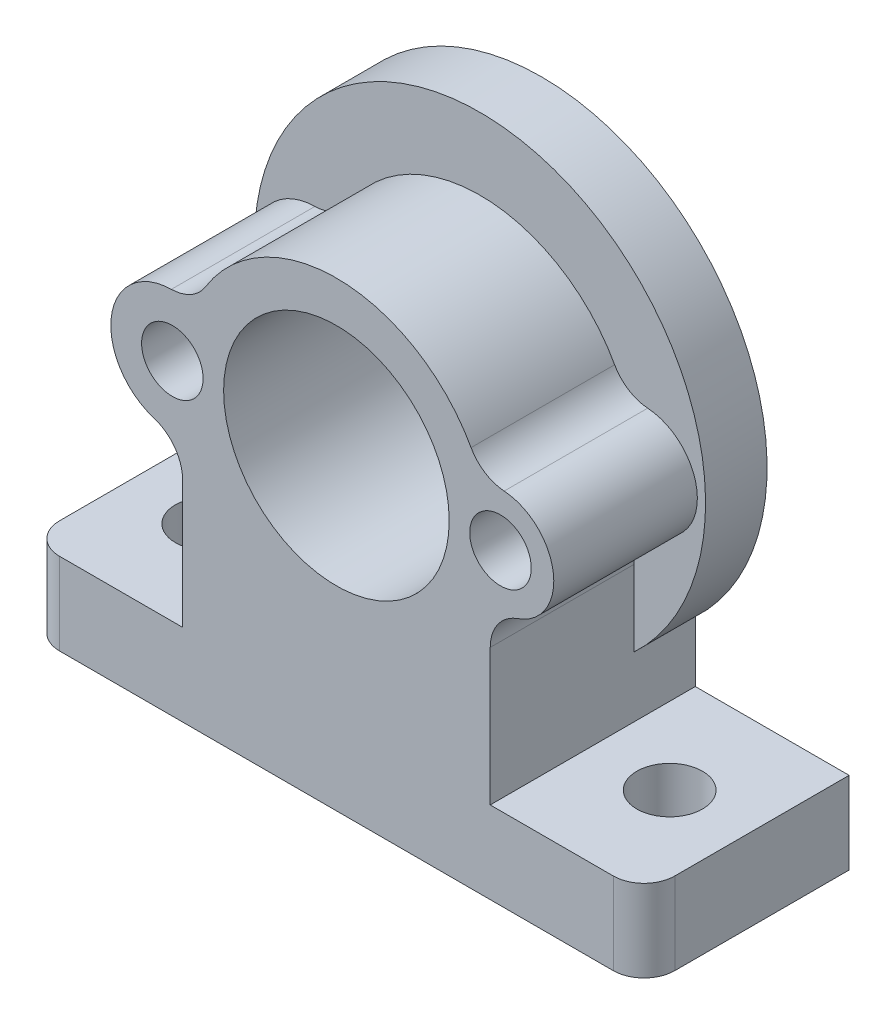
ISO-10303-21;
HEADER;
FILE_DESCRIPTION(('STEP AP214'),'2;1');
FILE_NAME('part.step','',(''),(''),'','','');
FILE_SCHEMA(('AUTOMOTIVE_DESIGN { 1 0 10303 214 1 1 1 1 }'));
ENDSEC;
DATA;
#1=APPLICATION_CONTEXT('core data for automotive mechanical design processes');
#2=APPLICATION_PROTOCOL_DEFINITION('international standard','automotive_design',2000,#1);
#3=PRODUCT_CONTEXT('',#1,'mechanical');
#4=PRODUCT('Part','Part','',(#3));
#5=PRODUCT_RELATED_PRODUCT_CATEGORY('part','',(#4));
#6=PRODUCT_DEFINITION_FORMATION('','',#4);
#7=PRODUCT_DEFINITION_CONTEXT('part definition',#1,'design');
#8=PRODUCT_DEFINITION('design','',#6,#7);
#9=PRODUCT_DEFINITION_SHAPE('','',#8);
#10=(LENGTH_UNIT() NAMED_UNIT(*) SI_UNIT(.MILLI.,.METRE.));
#11=(NAMED_UNIT(*) PLANE_ANGLE_UNIT() SI_UNIT($,.RADIAN.));
#12=(NAMED_UNIT(*) SI_UNIT($,.STERADIAN.) SOLID_ANGLE_UNIT());
#13=UNCERTAINTY_MEASURE_WITH_UNIT(LENGTH_MEASURE(1.E-05),#10,'distance_accuracy_value','');
#14=(GEOMETRIC_REPRESENTATION_CONTEXT(3) GLOBAL_UNCERTAINTY_ASSIGNED_CONTEXT((#13)) GLOBAL_UNIT_ASSIGNED_CONTEXT((#10,
#11,#12)) REPRESENTATION_CONTEXT('',''));
#15=CARTESIAN_POINT('',(0.,0.,0.));
#16=DIRECTION('',(0.,0.,1.));
#17=DIRECTION('',(1.,0.,0.));
#18=AXIS2_PLACEMENT_3D('',#15,#16,#17);
#19=CARTESIAN_POINT('',(0.,0.,3.));
#20=DIRECTION('',(0.,0.,-1.));
#21=DIRECTION('',(-1.,0.,0.));
#22=AXIS2_PLACEMENT_3D('',#19,#20,#21);
#23=PLANE('',#22);
#24=CARTESIAN_POINT('',(7.99999999999999,0.,3.));
#25=DIRECTION('',(0.,0.,-1.));
#26=DIRECTION('',(-1.,0.,0.));
#27=AXIS2_PLACEMENT_3D('',#24,#25,#26);
#28=CIRCLE('',#27,2.6);
#29=CARTESIAN_POINT('',(8.17980978260869,2.59377494052168,3.));
#30=VERTEX_POINT('',#29);
#31=CARTESIAN_POINT('',(8.84782608695652,-2.45788342406143,3.));
#32=VERTEX_POINT('',#31);
#33=EDGE_CURVE('E321',#30,#32,#28,.T.);
#34=ORIENTED_EDGE('',*,*,#33,.T.);
#35=CARTESIAN_POINT('',(9.5,-4.34856298103177,3.));
#36=DIRECTION('',(0.,0.,-1.));
#37=DIRECTION('',(-1.,0.,0.));
#38=AXIS2_PLACEMENT_3D('',#35,#36,#37);
#39=CIRCLE('',#38,2.);
#40=CARTESIAN_POINT('',(7.5,-4.34856298103177,3.));
#41=VERTEX_POINT('',#40);
#42=EDGE_CURVE('E259',#32,#41,#39,.F.);
#43=ORIENTED_EDGE('',*,*,#42,.T.);
#44=DIRECTION('',(0.,-1.,0.));
#45=VECTOR('',#44,1.);
#46=CARTESIAN_POINT('',(7.5,0.,3.));
#47=LINE('',#46,#45);
#48=CARTESIAN_POINT('',(7.5,-8.04673846971554,3.));
#49=VERTEX_POINT('',#48);
#50=EDGE_CURVE('E327',#41,#49,#47,.T.);
#51=ORIENTED_EDGE('',*,*,#50,.T.);
#52=CARTESIAN_POINT('',(0.,0.,3.));
#53=DIRECTION('',(0.,0.,-1.));
#54=DIRECTION('',(-1.,0.,0.));
#55=AXIS2_PLACEMENT_3D('',#52,#53,#54);
#56=CIRCLE('',#55,11.);
#57=CARTESIAN_POINT('',(-11.,0.,3.));
#58=VERTEX_POINT('',#57);
#59=EDGE_CURVE('E419',#58,#49,#56,.T.);
#60=ORIENTED_EDGE('',*,*,#59,.F.);
#61=CARTESIAN_POINT('',(-8.,0.,3.));
#62=DIRECTION('',(0.,0.,-1.));
#63=DIRECTION('',(-1.,0.,0.));
#64=AXIS2_PLACEMENT_3D('',#61,#62,#63);
#65=CIRCLE('',#64,3.);
#66=CARTESIAN_POINT('',(-8.046875,2.99963376670803,3.));
#67=VERTEX_POINT('',#66);
#68=EDGE_CURVE('E237',#58,#67,#65,.T.);
#69=ORIENTED_EDGE('',*,*,#68,.T.);
#70=CARTESIAN_POINT('',(-8.078125,4.99938961118005,3.));
#71=DIRECTION('',(0.,0.,-1.));
#72=DIRECTION('',(-1.,0.,0.));
#73=AXIS2_PLACEMENT_3D('',#70,#71,#72);
#74=CIRCLE('',#73,2.);
#75=CARTESIAN_POINT('',(-6.37746710526316,3.94688653514214,3.));
#76=VERTEX_POINT('',#75);
#77=EDGE_CURVE('E255',#67,#76,#74,.F.);
#78=ORIENTED_EDGE('',*,*,#77,.T.);
#79=CARTESIAN_POINT('',(0.,0.,3.));
#80=DIRECTION('',(0.,0.,-1.));
#81=DIRECTION('',(-1.,0.,0.));
#82=AXIS2_PLACEMENT_3D('',#79,#80,#81);
#83=CIRCLE('',#82,7.5);
#84=CARTESIAN_POINT('',(6.56694078947368,3.62288402623473,3.));
#85=VERTEX_POINT('',#84);
#86=EDGE_CURVE('E332',#76,#85,#83,.T.);
#87=ORIENTED_EDGE('',*,*,#86,.T.);
#88=CARTESIAN_POINT('',(8.318125,4.58898643323066,3.));
#89=DIRECTION('',(0.,0.,-1.));
#90=DIRECTION('',(-1.,0.,0.));
#91=AXIS2_PLACEMENT_3D('',#88,#89,#90);
#92=CIRCLE('',#91,2.);
#93=EDGE_CURVE('E257',#85,#30,#92,.F.);
#94=ORIENTED_EDGE('',*,*,#93,.T.);
#95=EDGE_LOOP('',(#34,#43,#51,#60,#69,#78,#87,#94));
#96=FACE_BOUND('',#95,.T.);
#97=ADVANCED_FACE('F35',(#96),#23,.F.);
#98=CARTESIAN_POINT('',(0.,0.,10.));
#99=DIRECTION('',(0.,0.,-1.));
#100=DIRECTION('',(-1.,0.,0.));
#101=AXIS2_PLACEMENT_3D('',#98,#99,#100);
#102=CYLINDRICAL_SURFACE('',#101,7.5);
#103=CARTESIAN_POINT('',(0.,0.,10.));
#104=DIRECTION('',(0.,0.,1.));
#105=DIRECTION('',(1.,0.,0.));
#106=AXIS2_PLACEMENT_3D('',#103,#104,#105);
#107=CIRCLE('',#106,7.5);
#108=CARTESIAN_POINT('',(6.56694078947368,3.62288402623473,10.));
#109=VERTEX_POINT('',#108);
#110=CARTESIAN_POINT('',(-6.37746710526316,3.94688653514214,10.));
#111=VERTEX_POINT('',#110);
#112=EDGE_CURVE('E190',#109,#111,#107,.T.);
#113=ORIENTED_EDGE('',*,*,#112,.F.);
#114=DIRECTION('',(0.,0.,-1.));
#115=VECTOR('',#114,1.);
#116=CARTESIAN_POINT('',(6.56694078947368,3.62288402623473,10.));
#117=LINE('',#116,#115);
#118=EDGE_CURVE('E264',#109,#85,#117,.T.);
#119=ORIENTED_EDGE('',*,*,#118,.T.);
#120=ORIENTED_EDGE('',*,*,#86,.F.);
#121=DIRECTION('',(0.,0.,-1.));
#122=VECTOR('',#121,1.);
#123=CARTESIAN_POINT('',(-6.37746710526316,3.94688653514215,10.));
#124=LINE('',#123,#122);
#125=EDGE_CURVE('E261',#76,#111,#124,.F.);
#126=ORIENTED_EDGE('',*,*,#125,.T.);
#127=EDGE_LOOP('',(#113,#119,#120,#126));
#128=FACE_BOUND('',#127,.T.);
#129=ADVANCED_FACE('F363',(#128),#102,.T.);
#130=CARTESIAN_POINT('',(-7.5,0.,10.));
#131=DIRECTION('',(-1.,0.,0.));
#132=DIRECTION('',(0.,0.,1.));
#133=AXIS2_PLACEMENT_3D('',#130,#131,#132);
#134=PLANE('',#133);
#135=DIRECTION('',(0.,1.,0.));
#136=VECTOR('',#135,1.);
#137=CARTESIAN_POINT('',(-7.5,0.,10.));
#138=LINE('',#137,#136);
#139=CARTESIAN_POINT('',(-7.5,-11.,10.));
#140=VERTEX_POINT('',#139);
#141=CARTESIAN_POINT('',(-7.5,-4.76969600708473,10.));
#142=VERTEX_POINT('',#141);
#143=EDGE_CURVE('E174',#140,#142,#138,.T.);
#144=ORIENTED_EDGE('',*,*,#143,.T.);
#145=DIRECTION('',(0.,0.,-1.));
#146=VECTOR('',#145,1.);
#147=CARTESIAN_POINT('',(-7.5,-4.76969600708473,3.));
#148=LINE('',#147,#146);
#149=CARTESIAN_POINT('',(-7.5,-4.76969600708473,3.));
#150=VERTEX_POINT('',#149);
#151=EDGE_CURVE('E243',#142,#150,#148,.T.);
#152=ORIENTED_EDGE('',*,*,#151,.T.);
#153=DIRECTION('',(0.,-1.,0.));
#154=VECTOR('',#153,1.);
#155=CARTESIAN_POINT('',(-7.5,0.,3.));
#156=LINE('',#155,#154);
#157=CARTESIAN_POINT('',(-7.5,-8.04673846971554,3.));
#158=VERTEX_POINT('',#157);
#159=EDGE_CURVE('E336',#150,#158,#156,.T.);
#160=ORIENTED_EDGE('',*,*,#159,.T.);
#161=DIRECTION('',(0.,0.,-1.));
#162=VECTOR('',#161,1.);
#163=CARTESIAN_POINT('',(-7.5,-8.04673846971554,3.));
#164=LINE('',#163,#162);
#165=CARTESIAN_POINT('',(-7.5,-8.04673846971554,0.));
#166=VERTEX_POINT('',#165);
#167=EDGE_CURVE('E333',#166,#158,#164,.F.);
#168=ORIENTED_EDGE('',*,*,#167,.F.);
#169=DIRECTION('',(0.,1.,0.));
#170=VECTOR('',#169,1.);
#171=CARTESIAN_POINT('',(-7.5,0.,0.));
#172=LINE('',#171,#170);
#173=CARTESIAN_POINT('',(-7.5,-11.,0.));
#174=VERTEX_POINT('',#173);
#175=EDGE_CURVE('E181',#174,#166,#172,.T.);
#176=ORIENTED_EDGE('',*,*,#175,.F.);
#177=DIRECTION('',(0.,0.,-1.));
#178=VECTOR('',#177,1.);
#179=CARTESIAN_POINT('',(-7.5,-11.,10.));
#180=LINE('',#179,#178);
#181=EDGE_CURVE('E167',#140,#174,#180,.T.);
#182=ORIENTED_EDGE('',*,*,#181,.F.);
#183=EDGE_LOOP('',(#144,#152,#160,#168,#176,#182));
#184=FACE_BOUND('',#183,.T.);
#185=ADVANCED_FACE('F178',(#184),#134,.T.);
#186=CARTESIAN_POINT('',(0.,-11.,10.));
#187=DIRECTION('',(0.,1.,0.));
#188=DIRECTION('',(0.,0.,1.));
#189=AXIS2_PLACEMENT_3D('',#186,#187,#188);
#190=PLANE('',#189);
#191=CARTESIAN_POINT('',(-11.25,-11.,5.));
#192=DIRECTION('',(0.,1.,0.));
#193=DIRECTION('',(0.,0.,1.));
#194=AXIS2_PLACEMENT_3D('',#191,#192,#193);
#195=CIRCLE('',#194,1.6);
#196=CARTESIAN_POINT('',(-11.25,-11.,6.6));
#197=VERTEX_POINT('',#196);
#198=EDGE_CURVE('E347',#197,#197,#195,.T.);
#199=ORIENTED_EDGE('',*,*,#198,.F.);
#200=EDGE_LOOP('',(#199));
#201=FACE_BOUND('',#200,.T.);
#202=DIRECTION('',(0.,0.,-1.));
#203=VECTOR('',#202,1.);
#204=CARTESIAN_POINT('',(-15.,-11.,10.));
#205=LINE('',#204,#203);
#206=CARTESIAN_POINT('',(-15.,-11.,8.5));
#207=VERTEX_POINT('',#206);
#208=CARTESIAN_POINT('',(-15.,-11.,0.));
#209=VERTEX_POINT('',#208);
#210=EDGE_CURVE('E184',#207,#209,#205,.T.);
#211=ORIENTED_EDGE('',*,*,#210,.F.);
#212=CARTESIAN_POINT('',(-13.5,-11.,8.5));
#213=DIRECTION('',(0.,1.,0.));
#214=DIRECTION('',(0.,0.,1.));
#215=AXIS2_PLACEMENT_3D('',#212,#213,#214);
#216=CIRCLE('',#215,1.5);
#217=CARTESIAN_POINT('',(-13.5,-11.,10.));
#218=VERTEX_POINT('',#217);
#219=EDGE_CURVE('E11',#207,#218,#216,.T.);
#220=ORIENTED_EDGE('',*,*,#219,.T.);
#221=DIRECTION('',(1.,0.,0.));
#222=VECTOR('',#221,1.);
#223=CARTESIAN_POINT('',(0.,-11.,10.));
#224=LINE('',#223,#222);
#225=EDGE_CURVE('E163',#218,#140,#224,.T.);
#226=ORIENTED_EDGE('',*,*,#225,.T.);
#227=ORIENTED_EDGE('',*,*,#181,.T.);
#228=DIRECTION('',(1.,0.,0.));
#229=VECTOR('',#228,1.);
#230=CARTESIAN_POINT('',(0.,-11.,0.));
#231=LINE('',#230,#229);
#232=EDGE_CURVE('E208',#209,#174,#231,.T.);
#233=ORIENTED_EDGE('',*,*,#232,.F.);
#234=EDGE_LOOP('',(#211,#220,#226,#227,#233));
#235=FACE_BOUND('',#234,.T.);
#236=ADVANCED_FACE('F165',(#201,#235),#190,.T.);
#237=CARTESIAN_POINT('',(-15.,0.,10.));
#238=DIRECTION('',(1.,0.,0.));
#239=DIRECTION('',(0.,0.,-1.));
#240=AXIS2_PLACEMENT_3D('',#237,#238,#239);
#241=PLANE('',#240);
#242=DIRECTION('',(0.,0.,-1.));
#243=VECTOR('',#242,1.);
#244=CARTESIAN_POINT('',(-15.,-15.,10.));
#245=LINE('',#244,#243);
#246=CARTESIAN_POINT('',(-15.,-15.,8.5));
#247=VERTEX_POINT('',#246);
#248=CARTESIAN_POINT('',(-15.,-15.,0.));
#249=VERTEX_POINT('',#248);
#250=EDGE_CURVE('E233',#247,#249,#245,.T.);
#251=ORIENTED_EDGE('',*,*,#250,.F.);
#252=DIRECTION('',(0.,-1.,0.));
#253=VECTOR('',#252,1.);
#254=CARTESIAN_POINT('',(-15.,-11.,8.5));
#255=LINE('',#254,#253);
#256=EDGE_CURVE('E43',#247,#207,#255,.F.);
#257=ORIENTED_EDGE('',*,*,#256,.T.);
#258=ORIENTED_EDGE('',*,*,#210,.T.);
#259=DIRECTION('',(0.,-1.,0.));
#260=VECTOR('',#259,1.);
#261=CARTESIAN_POINT('',(-15.,0.,0.));
#262=LINE('',#261,#260);
#263=EDGE_CURVE('E211',#209,#249,#262,.T.);
#264=ORIENTED_EDGE('',*,*,#263,.T.);
#265=EDGE_LOOP('',(#251,#257,#258,#264));
#266=FACE_BOUND('',#265,.T.);
#267=ADVANCED_FACE('F300',(#266),#241,.F.);
#268=CARTESIAN_POINT('',(0.,-15.,10.));
#269=DIRECTION('',(0.,1.,0.));
#270=DIRECTION('',(-1.,0.,0.));
#271=AXIS2_PLACEMENT_3D('',#268,#269,#270);
#272=PLANE('',#271);
#273=CARTESIAN_POINT('',(11.25,-15.,5.));
#274=DIRECTION('',(0.,1.,0.));
#275=DIRECTION('',(0.,0.,1.));
#276=AXIS2_PLACEMENT_3D('',#273,#274,#275);
#277=CIRCLE('',#276,1.6);
#278=CARTESIAN_POINT('',(11.25,-15.,6.6));
#279=VERTEX_POINT('',#278);
#280=EDGE_CURVE('E344',#279,#279,#277,.T.);
#281=ORIENTED_EDGE('',*,*,#280,.T.);
#282=EDGE_LOOP('',(#281));
#283=FACE_BOUND('',#282,.T.);
#284=CARTESIAN_POINT('',(-11.25,-15.,5.));
#285=DIRECTION('',(0.,1.,0.));
#286=DIRECTION('',(0.,0.,1.));
#287=AXIS2_PLACEMENT_3D('',#284,#285,#286);
#288=CIRCLE('',#287,1.6);
#289=CARTESIAN_POINT('',(-11.25,-15.,6.6));
#290=VERTEX_POINT('',#289);
#291=EDGE_CURVE('E209',#290,#290,#288,.T.);
#292=ORIENTED_EDGE('',*,*,#291,.T.);
#293=EDGE_LOOP('',(#292));
#294=FACE_BOUND('',#293,.T.);
#295=DIRECTION('',(0.,0.,-1.));
#296=VECTOR('',#295,1.);
#297=CARTESIAN_POINT('',(15.,-15.,10.));
#298=LINE('',#297,#296);
#299=CARTESIAN_POINT('',(15.,-15.,8.5));
#300=VERTEX_POINT('',#299);
#301=CARTESIAN_POINT('',(15.,-15.,0.));
#302=VERTEX_POINT('',#301);
#303=EDGE_CURVE('E231',#300,#302,#298,.T.);
#304=ORIENTED_EDGE('',*,*,#303,.F.);
#305=CARTESIAN_POINT('',(13.5,-15.,8.5));
#306=DIRECTION('',(0.,1.,0.));
#307=DIRECTION('',(-1.,0.,0.));
#308=AXIS2_PLACEMENT_3D('',#305,#306,#307);
#309=CIRCLE('',#308,1.5);
#310=CARTESIAN_POINT('',(13.5,-15.,10.));
#311=VERTEX_POINT('',#310);
#312=EDGE_CURVE('E278',#300,#311,#309,.F.);
#313=ORIENTED_EDGE('',*,*,#312,.T.);
#314=DIRECTION('',(1.,0.,0.));
#315=VECTOR('',#314,1.);
#316=CARTESIAN_POINT('',(0.,-15.,10.));
#317=LINE('',#316,#315);
#318=CARTESIAN_POINT('',(-13.5,-15.,10.));
#319=VERTEX_POINT('',#318);
#320=EDGE_CURVE('E173',#319,#311,#317,.T.);
#321=ORIENTED_EDGE('',*,*,#320,.F.);
#322=CARTESIAN_POINT('',(-13.5,-15.,8.5));
#323=DIRECTION('',(0.,1.,0.));
#324=DIRECTION('',(-1.,0.,0.));
#325=AXIS2_PLACEMENT_3D('',#322,#323,#324);
#326=CIRCLE('',#325,1.5);
#327=EDGE_CURVE('E276',#319,#247,#326,.F.);
#328=ORIENTED_EDGE('',*,*,#327,.T.);
#329=ORIENTED_EDGE('',*,*,#250,.T.);
#330=DIRECTION('',(1.,0.,0.));
#331=VECTOR('',#330,1.);
#332=CARTESIAN_POINT('',(0.,-15.,0.));
#333=LINE('',#332,#331);
#334=EDGE_CURVE('E214',#249,#302,#333,.T.);
#335=ORIENTED_EDGE('',*,*,#334,.T.);
#336=EDGE_LOOP('',(#304,#313,#321,#328,#329,#335));
#337=FACE_BOUND('',#336,.T.);
#338=ADVANCED_FACE('F298',(#283,#294,#337),#272,.F.);
#339=CARTESIAN_POINT('',(15.,0.,10.));
#340=DIRECTION('',(1.,0.,0.));
#341=DIRECTION('',(0.,0.,-1.));
#342=AXIS2_PLACEMENT_3D('',#339,#340,#341);
#343=PLANE('',#342);
#344=DIRECTION('',(0.,0.,-1.));
#345=VECTOR('',#344,1.);
#346=CARTESIAN_POINT('',(15.,-11.,10.));
#347=LINE('',#346,#345);
#348=CARTESIAN_POINT('',(15.,-11.,8.5));
#349=VERTEX_POINT('',#348);
#350=CARTESIAN_POINT('',(15.,-11.,0.));
#351=VERTEX_POINT('',#350);
#352=EDGE_CURVE('E229',#349,#351,#347,.T.);
#353=ORIENTED_EDGE('',*,*,#352,.F.);
#354=DIRECTION('',(0.,-1.,0.));
#355=VECTOR('',#354,1.);
#356=CARTESIAN_POINT('',(15.,0.,8.5));
#357=LINE('',#356,#355);
#358=EDGE_CURVE('E273',#349,#300,#357,.T.);
#359=ORIENTED_EDGE('',*,*,#358,.T.);
#360=ORIENTED_EDGE('',*,*,#303,.T.);
#361=DIRECTION('',(0.,-1.,0.));
#362=VECTOR('',#361,1.);
#363=CARTESIAN_POINT('',(15.,0.,0.));
#364=LINE('',#363,#362);
#365=EDGE_CURVE('E217',#351,#302,#364,.T.);
#366=ORIENTED_EDGE('',*,*,#365,.F.);
#367=EDGE_LOOP('',(#353,#359,#360,#366));
#368=FACE_BOUND('',#367,.T.);
#369=ADVANCED_FACE('F293',(#368),#343,.T.);
#370=CARTESIAN_POINT('',(0.,-11.,10.));
#371=DIRECTION('',(0.,1.,0.));
#372=DIRECTION('',(0.,0.,1.));
#373=AXIS2_PLACEMENT_3D('',#370,#371,#372);
#374=PLANE('',#373);
#375=CARTESIAN_POINT('',(11.25,-11.,5.));
#376=DIRECTION('',(0.,1.,0.));
#377=DIRECTION('',(0.,0.,1.));
#378=AXIS2_PLACEMENT_3D('',#375,#376,#377);
#379=CIRCLE('',#378,1.6);
#380=CARTESIAN_POINT('',(11.25,-11.,6.6));
#381=VERTEX_POINT('',#380);
#382=EDGE_CURVE('E343',#381,#381,#379,.T.);
#383=ORIENTED_EDGE('',*,*,#382,.F.);
#384=EDGE_LOOP('',(#383));
#385=FACE_BOUND('',#384,.T.);
#386=DIRECTION('',(1.,0.,0.));
#387=VECTOR('',#386,1.);
#388=CARTESIAN_POINT('',(0.,-11.,10.));
#389=LINE('',#388,#387);
#390=CARTESIAN_POINT('',(7.5,-11.,10.));
#391=VERTEX_POINT('',#390);
#392=CARTESIAN_POINT('',(13.5,-11.,10.));
#393=VERTEX_POINT('',#392);
#394=EDGE_CURVE('E198',#391,#393,#389,.T.);
#395=ORIENTED_EDGE('',*,*,#394,.T.);
#396=CARTESIAN_POINT('',(13.5,-11.,8.5));
#397=DIRECTION('',(0.,1.,0.));
#398=DIRECTION('',(0.,0.,1.));
#399=AXIS2_PLACEMENT_3D('',#396,#397,#398);
#400=CIRCLE('',#399,1.5);
#401=EDGE_CURVE('E283',#393,#349,#400,.T.);
#402=ORIENTED_EDGE('',*,*,#401,.T.);
#403=ORIENTED_EDGE('',*,*,#352,.T.);
#404=DIRECTION('',(1.,0.,0.));
#405=VECTOR('',#404,1.);
#406=CARTESIAN_POINT('',(0.,-11.,0.));
#407=LINE('',#406,#405);
#408=CARTESIAN_POINT('',(7.5,-11.,0.));
#409=VERTEX_POINT('',#408);
#410=EDGE_CURVE('E220',#409,#351,#407,.T.);
#411=ORIENTED_EDGE('',*,*,#410,.F.);
#412=DIRECTION('',(0.,0.,-1.));
#413=VECTOR('',#412,1.);
#414=CARTESIAN_POINT('',(7.5,-11.,10.));
#415=LINE('',#414,#413);
#416=EDGE_CURVE('E206',#391,#409,#415,.T.);
#417=ORIENTED_EDGE('',*,*,#416,.F.);
#418=EDGE_LOOP('',(#395,#402,#403,#411,#417));
#419=FACE_BOUND('',#418,.T.);
#420=ADVANCED_FACE('F287',(#385,#419),#374,.T.);
#421=CARTESIAN_POINT('',(7.5,0.,10.));
#422=DIRECTION('',(-1.,0.,0.));
#423=DIRECTION('',(0.,0.,1.));
#424=AXIS2_PLACEMENT_3D('',#421,#422,#423);
#425=PLANE('',#424);
#426=ORIENTED_EDGE('',*,*,#50,.F.);
#427=DIRECTION('',(0.,0.,1.));
#428=VECTOR('',#427,1.);
#429=CARTESIAN_POINT('',(7.5,-4.34856298103177,10.));
#430=LINE('',#429,#428);
#431=CARTESIAN_POINT('',(7.5,-4.34856298103177,10.));
#432=VERTEX_POINT('',#431);
#433=EDGE_CURVE('E247',#41,#432,#430,.T.);
#434=ORIENTED_EDGE('',*,*,#433,.T.);
#435=DIRECTION('',(0.,1.,0.));
#436=VECTOR('',#435,1.);
#437=CARTESIAN_POINT('',(7.5,0.,10.));
#438=LINE('',#437,#436);
#439=EDGE_CURVE('E200',#391,#432,#438,.T.);
#440=ORIENTED_EDGE('',*,*,#439,.F.);
#441=ORIENTED_EDGE('',*,*,#416,.T.);
#442=DIRECTION('',(0.,1.,0.));
#443=VECTOR('',#442,1.);
#444=CARTESIAN_POINT('',(7.5,0.,0.));
#445=LINE('',#444,#443);
#446=CARTESIAN_POINT('',(7.5,-8.04673846971554,0.));
#447=VERTEX_POINT('',#446);
#448=EDGE_CURVE('E223',#409,#447,#445,.T.);
#449=ORIENTED_EDGE('',*,*,#448,.T.);
#450=DIRECTION('',(0.,0.,-1.));
#451=VECTOR('',#450,1.);
#452=CARTESIAN_POINT('',(7.5,-8.04673846971554,3.));
#453=LINE('',#452,#451);
#454=EDGE_CURVE('E331',#447,#49,#453,.F.);
#455=ORIENTED_EDGE('',*,*,#454,.T.);
#456=EDGE_LOOP('',(#426,#434,#440,#441,#449,#455));
#457=FACE_BOUND('',#456,.T.);
#458=ADVANCED_FACE('F309',(#457),#425,.F.);
#459=CARTESIAN_POINT('',(0.,0.,10.));
#460=DIRECTION('',(0.,0.,-1.));
#461=DIRECTION('',(-1.,0.,0.));
#462=AXIS2_PLACEMENT_3D('',#459,#460,#461);
#463=CYLINDRICAL_SURFACE('',#462,5.5);
#464=CARTESIAN_POINT('',(0.,0.,0.));
#465=DIRECTION('',(0.,0.,1.));
#466=DIRECTION('',(1.,0.,0.));
#467=AXIS2_PLACEMENT_3D('',#464,#465,#466);
#468=CIRCLE('',#467,5.5);
#469=CARTESIAN_POINT('',(5.5,0.,0.));
#470=VERTEX_POINT('',#469);
#471=EDGE_CURVE('E193',#470,#470,#468,.T.);
#472=ORIENTED_EDGE('',*,*,#471,.F.);
#473=EDGE_LOOP('',(#472));
#474=FACE_BOUND('',#473,.T.);
#475=CARTESIAN_POINT('',(0.,0.,10.));
#476=DIRECTION('',(0.,0.,1.));
#477=DIRECTION('',(1.,0.,0.));
#478=AXIS2_PLACEMENT_3D('',#475,#476,#477);
#479=CIRCLE('',#478,5.5);
#480=CARTESIAN_POINT('',(5.5,0.,10.));
#481=VERTEX_POINT('',#480);
#482=EDGE_CURVE('E203',#481,#481,#479,.T.);
#483=ORIENTED_EDGE('',*,*,#482,.T.);
#484=EDGE_LOOP('',(#483));
#485=FACE_BOUND('',#484,.T.);
#486=ADVANCED_FACE('F461',(#474,#485),#463,.F.);
#487=CARTESIAN_POINT('',(0.,0.,10.));
#488=DIRECTION('',(0.,0.,1.));
#489=DIRECTION('',(1.,0.,0.));
#490=AXIS2_PLACEMENT_3D('',#487,#488,#489);
#491=PLANE('',#490);
#492=ORIENTED_EDGE('',*,*,#320,.T.);
#493=DIRECTION('',(0.,-1.,0.));
#494=VECTOR('',#493,1.);
#495=CARTESIAN_POINT('',(13.5,0.,10.));
#496=LINE('',#495,#494);
#497=EDGE_CURVE('E57',#311,#393,#496,.F.);
#498=ORIENTED_EDGE('',*,*,#497,.T.);
#499=ORIENTED_EDGE('',*,*,#394,.F.);
#500=ORIENTED_EDGE('',*,*,#439,.T.);
#501=CARTESIAN_POINT('',(9.5,-4.34856298103177,10.));
#502=DIRECTION('',(0.,0.,1.));
#503=DIRECTION('',(1.,0.,0.));
#504=AXIS2_PLACEMENT_3D('',#501,#502,#503);
#505=CIRCLE('',#504,2.);
#506=CARTESIAN_POINT('',(8.84782608695652,-2.45788342406143,10.));
#507=VERTEX_POINT('',#506);
#508=EDGE_CURVE('E267',#432,#507,#505,.F.);
#509=ORIENTED_EDGE('',*,*,#508,.T.);
#510=CARTESIAN_POINT('',(7.99999999999999,0.,10.));
#511=DIRECTION('',(0.,0.,1.));
#512=DIRECTION('',(1.,0.,0.));
#513=AXIS2_PLACEMENT_3D('',#510,#511,#512);
#514=CIRCLE('',#513,2.6);
#515=CARTESIAN_POINT('',(8.17980978260869,2.59377494052168,10.));
#516=VERTEX_POINT('',#515);
#517=EDGE_CURVE('E313',#507,#516,#514,.T.);
#518=ORIENTED_EDGE('',*,*,#517,.T.);
#519=CARTESIAN_POINT('',(8.318125,4.58898643323066,10.));
#520=DIRECTION('',(0.,0.,1.));
#521=DIRECTION('',(1.,0.,0.));
#522=AXIS2_PLACEMENT_3D('',#519,#520,#521);
#523=CIRCLE('',#522,2.);
#524=EDGE_CURVE('E269',#516,#109,#523,.F.);
#525=ORIENTED_EDGE('',*,*,#524,.T.);
#526=ORIENTED_EDGE('',*,*,#112,.T.);
#527=CARTESIAN_POINT('',(-8.078125,4.99938961118005,10.));
#528=DIRECTION('',(0.,0.,1.));
#529=DIRECTION('',(1.,0.,0.));
#530=AXIS2_PLACEMENT_3D('',#527,#528,#529);
#531=CIRCLE('',#530,2.);
#532=CARTESIAN_POINT('',(-8.046875,2.99963376670803,10.));
#533=VERTEX_POINT('',#532);
#534=EDGE_CURVE('E271',#111,#533,#531,.F.);
#535=ORIENTED_EDGE('',*,*,#534,.T.);
#536=CARTESIAN_POINT('',(-8.,0.,10.));
#537=DIRECTION('',(0.,0.,1.));
#538=DIRECTION('',(1.,0.,0.));
#539=AXIS2_PLACEMENT_3D('',#536,#537,#538);
#540=CIRCLE('',#539,3.);
#541=CARTESIAN_POINT('',(-8.9,-2.86181760425084,10.));
#542=VERTEX_POINT('',#541);
#543=EDGE_CURVE('E399',#533,#542,#540,.T.);
#544=ORIENTED_EDGE('',*,*,#543,.T.);
#545=CARTESIAN_POINT('',(-9.5,-4.76969600708473,10.));
#546=DIRECTION('',(0.,0.,1.));
#547=DIRECTION('',(1.,0.,0.));
#548=AXIS2_PLACEMENT_3D('',#545,#546,#547);
#549=CIRCLE('',#548,2.);
#550=EDGE_CURVE('E189',#542,#142,#549,.F.);
#551=ORIENTED_EDGE('',*,*,#550,.T.);
#552=ORIENTED_EDGE('',*,*,#143,.F.);
#553=ORIENTED_EDGE('',*,*,#225,.F.);
#554=DIRECTION('',(0.,-1.,0.));
#555=VECTOR('',#554,1.);
#556=CARTESIAN_POINT('',(-13.5,-15.,10.));
#557=LINE('',#556,#555);
#558=EDGE_CURVE('E280',#218,#319,#557,.T.);
#559=ORIENTED_EDGE('',*,*,#558,.T.);
#560=EDGE_LOOP('',(#492,#498,#499,#500,#509,#518,#525,#526,#535,#544,#551,#552,#553,#559));
#561=FACE_BOUND('',#560,.T.);
#562=CARTESIAN_POINT('',(7.99999999999999,0.,10.));
#563=DIRECTION('',(0.,0.,-1.));
#564=DIRECTION('',(1.,0.,0.));
#565=AXIS2_PLACEMENT_3D('',#562,#563,#564);
#566=CIRCLE('',#565,1.5);
#567=CARTESIAN_POINT('',(9.49999999999998,0.,10.));
#568=VERTEX_POINT('',#567);
#569=EDGE_CURVE('E405',#568,#568,#566,.T.);
#570=ORIENTED_EDGE('',*,*,#569,.T.);
#571=EDGE_LOOP('',(#570));
#572=FACE_BOUND('',#571,.T.);
#573=CARTESIAN_POINT('',(-8.,0.,10.));
#574=DIRECTION('',(0.,0.,-1.));
#575=DIRECTION('',(-1.,0.,0.));
#576=AXIS2_PLACEMENT_3D('',#573,#574,#575);
#577=CIRCLE('',#576,1.5);
#578=CARTESIAN_POINT('',(-9.5,0.,10.));
#579=VERTEX_POINT('',#578);
#580=EDGE_CURVE('E412',#579,#579,#577,.T.);
#581=ORIENTED_EDGE('',*,*,#580,.T.);
#582=EDGE_LOOP('',(#581));
#583=FACE_BOUND('',#582,.T.);
#584=ORIENTED_EDGE('',*,*,#482,.F.);
#585=EDGE_LOOP('',(#584));
#586=FACE_BOUND('',#585,.T.);
#587=ADVANCED_FACE('F186',(#561,#572,#583,#586),#491,.T.);
#588=CARTESIAN_POINT('',(0.,0.,0.));
#589=DIRECTION('',(0.,0.,1.));
#590=DIRECTION('',(1.,0.,0.));
#591=AXIS2_PLACEMENT_3D('',#588,#589,#590);
#592=PLANE('',#591);
#593=CARTESIAN_POINT('',(7.99999999999999,0.,0.));
#594=DIRECTION('',(0.,0.,-1.));
#595=DIRECTION('',(1.,0.,0.));
#596=AXIS2_PLACEMENT_3D('',#593,#594,#595);
#597=CIRCLE('',#596,1.5);
#598=CARTESIAN_POINT('',(9.49999999999998,0.,0.));
#599=VERTEX_POINT('',#598);
#600=EDGE_CURVE('E402',#599,#599,#597,.T.);
#601=ORIENTED_EDGE('',*,*,#600,.F.);
#602=EDGE_LOOP('',(#601));
#603=FACE_BOUND('',#602,.T.);
#604=ORIENTED_EDGE('',*,*,#471,.T.);
#605=EDGE_LOOP('',(#604));
#606=FACE_BOUND('',#605,.T.);
#607=CARTESIAN_POINT('',(-8.,0.,0.));
#608=DIRECTION('',(0.,0.,-1.));
#609=DIRECTION('',(-1.,0.,0.));
#610=AXIS2_PLACEMENT_3D('',#607,#608,#609);
#611=CIRCLE('',#610,1.5);
#612=CARTESIAN_POINT('',(-9.5,0.,0.));
#613=VERTEX_POINT('',#612);
#614=EDGE_CURVE('E410',#613,#613,#611,.T.);
#615=ORIENTED_EDGE('',*,*,#614,.F.);
#616=EDGE_LOOP('',(#615));
#617=FACE_BOUND('',#616,.T.);
#618=CARTESIAN_POINT('',(0.,0.,0.));
#619=DIRECTION('',(0.,0.,-1.));
#620=DIRECTION('',(-1.,0.,0.));
#621=AXIS2_PLACEMENT_3D('',#618,#619,#620);
#622=CIRCLE('',#621,11.);
#623=EDGE_CURVE('E415',#166,#447,#622,.T.);
#624=ORIENTED_EDGE('',*,*,#623,.T.);
#625=ORIENTED_EDGE('',*,*,#448,.F.);
#626=ORIENTED_EDGE('',*,*,#410,.T.);
#627=ORIENTED_EDGE('',*,*,#365,.T.);
#628=ORIENTED_EDGE('',*,*,#334,.F.);
#629=ORIENTED_EDGE('',*,*,#263,.F.);
#630=ORIENTED_EDGE('',*,*,#232,.T.);
#631=ORIENTED_EDGE('',*,*,#175,.T.);
#632=EDGE_LOOP('',(#624,#625,#626,#627,#628,#629,#630,#631));
#633=FACE_BOUND('',#632,.T.);
#634=ADVANCED_FACE('F304',(#603,#606,#617,#633),#592,.F.);
#635=CARTESIAN_POINT('',(-11.25,-15.,5.));
#636=DIRECTION('',(0.,1.,0.));
#637=DIRECTION('',(0.,0.,1.));
#638=AXIS2_PLACEMENT_3D('',#635,#636,#637);
#639=CYLINDRICAL_SURFACE('',#638,1.6);
#640=ORIENTED_EDGE('',*,*,#291,.F.);
#641=EDGE_LOOP('',(#640));
#642=FACE_BOUND('',#641,.T.);
#643=ORIENTED_EDGE('',*,*,#198,.T.);
#644=EDGE_LOOP('',(#643));
#645=FACE_BOUND('',#644,.T.);
#646=ADVANCED_FACE('F354',(#642,#645),#639,.F.);
#647=CARTESIAN_POINT('',(11.25,-15.,5.));
#648=DIRECTION('',(0.,1.,0.));
#649=DIRECTION('',(0.,0.,1.));
#650=AXIS2_PLACEMENT_3D('',#647,#648,#649);
#651=CYLINDRICAL_SURFACE('',#650,1.6);
#652=ORIENTED_EDGE('',*,*,#280,.F.);
#653=EDGE_LOOP('',(#652));
#654=FACE_BOUND('',#653,.T.);
#655=ORIENTED_EDGE('',*,*,#382,.T.);
#656=EDGE_LOOP('',(#655));
#657=FACE_BOUND('',#656,.T.);
#658=ADVANCED_FACE('F385',(#654,#657),#651,.F.);
#659=CARTESIAN_POINT('',(0.,0.,3.));
#660=DIRECTION('',(0.,0.,-1.));
#661=DIRECTION('',(-1.,0.,0.));
#662=AXIS2_PLACEMENT_3D('',#659,#660,#661);
#663=CYLINDRICAL_SURFACE('',#662,11.);
#664=EDGE_CURVE('E392',#158,#58,#56,.T.);
#665=ORIENTED_EDGE('',*,*,#664,.T.);
#666=ORIENTED_EDGE('',*,*,#59,.T.);
#667=ORIENTED_EDGE('',*,*,#454,.F.);
#668=ORIENTED_EDGE('',*,*,#623,.F.);
#669=ORIENTED_EDGE('',*,*,#167,.T.);
#670=EDGE_LOOP('',(#665,#666,#667,#668,#669));
#671=FACE_BOUND('',#670,.T.);
#672=ADVANCED_FACE('F377',(#671),#663,.T.);
#673=ORIENTED_EDGE('',*,*,#159,.F.);
#674=CARTESIAN_POINT('',(-9.5,-4.76969600708473,3.));
#675=DIRECTION('',(0.,0.,-1.));
#676=DIRECTION('',(-1.,0.,0.));
#677=AXIS2_PLACEMENT_3D('',#674,#675,#676);
#678=CIRCLE('',#677,2.);
#679=CARTESIAN_POINT('',(-8.9,-2.86181760425084,3.));
#680=VERTEX_POINT('',#679);
#681=EDGE_CURVE('E245',#150,#680,#678,.F.);
#682=ORIENTED_EDGE('',*,*,#681,.T.);
#683=EDGE_CURVE('E183',#680,#58,#65,.T.);
#684=ORIENTED_EDGE('',*,*,#683,.T.);
#685=ORIENTED_EDGE('',*,*,#664,.F.);
#686=EDGE_LOOP('',(#673,#682,#684,#685));
#687=FACE_BOUND('',#686,.T.);
#688=ADVANCED_FACE('F367',(#687),#23,.F.);
#689=CARTESIAN_POINT('',(-8.,0.,10.));
#690=DIRECTION('',(0.,0.,-1.));
#691=DIRECTION('',(-1.,0.,0.));
#692=AXIS2_PLACEMENT_3D('',#689,#690,#691);
#693=CYLINDRICAL_SURFACE('',#692,1.5);
#694=ORIENTED_EDGE('',*,*,#580,.F.);
#695=EDGE_LOOP('',(#694));
#696=FACE_BOUND('',#695,.T.);
#697=ORIENTED_EDGE('',*,*,#614,.T.);
#698=EDGE_LOOP('',(#697));
#699=FACE_BOUND('',#698,.T.);
#700=ADVANCED_FACE('F376',(#696,#699),#693,.F.);
#701=CARTESIAN_POINT('',(7.99999999999999,0.,10.));
#702=DIRECTION('',(0.,0.,-1.));
#703=DIRECTION('',(-1.,0.,0.));
#704=AXIS2_PLACEMENT_3D('',#701,#702,#703);
#705=CYLINDRICAL_SURFACE('',#704,1.5);
#706=ORIENTED_EDGE('',*,*,#600,.T.);
#707=EDGE_LOOP('',(#706));
#708=FACE_BOUND('',#707,.T.);
#709=ORIENTED_EDGE('',*,*,#569,.F.);
#710=EDGE_LOOP('',(#709));
#711=FACE_BOUND('',#710,.T.);
#712=ADVANCED_FACE('F383',(#708,#711),#705,.F.);
#713=CARTESIAN_POINT('',(-8.,0.,0.));
#714=DIRECTION('',(0.,0.,1.));
#715=DIRECTION('',(1.,0.,0.));
#716=AXIS2_PLACEMENT_3D('',#713,#714,#715);
#717=CYLINDRICAL_SURFACE('',#716,3.);
#718=ORIENTED_EDGE('',*,*,#683,.F.);
#719=DIRECTION('',(0.,0.,1.));
#720=VECTOR('',#719,1.);
#721=CARTESIAN_POINT('',(-8.9,-2.86181760425084,0.));
#722=LINE('',#721,#720);
#723=EDGE_CURVE('E240',#680,#542,#722,.T.);
#724=ORIENTED_EDGE('',*,*,#723,.T.);
#725=ORIENTED_EDGE('',*,*,#543,.F.);
#726=DIRECTION('',(0.,0.,1.));
#727=VECTOR('',#726,1.);
#728=CARTESIAN_POINT('',(-8.046875,2.99963376670803,0.));
#729=LINE('',#728,#727);
#730=EDGE_CURVE('E238',#533,#67,#729,.F.);
#731=ORIENTED_EDGE('',*,*,#730,.T.);
#732=ORIENTED_EDGE('',*,*,#68,.F.);
#733=EDGE_LOOP('',(#718,#724,#725,#731,#732));
#734=FACE_BOUND('',#733,.T.);
#735=ADVANCED_FACE('F398',(#734),#717,.T.);
#736=CARTESIAN_POINT('',(7.99999999999999,0.,0.));
#737=DIRECTION('',(0.,0.,1.));
#738=DIRECTION('',(1.,0.,0.));
#739=AXIS2_PLACEMENT_3D('',#736,#737,#738);
#740=CYLINDRICAL_SURFACE('',#739,2.6);
#741=ORIENTED_EDGE('',*,*,#517,.F.);
#742=DIRECTION('',(0.,0.,1.));
#743=VECTOR('',#742,1.);
#744=CARTESIAN_POINT('',(8.84782608695652,-2.45788342406143,0.));
#745=LINE('',#744,#743);
#746=EDGE_CURVE('E253',#507,#32,#745,.F.);
#747=ORIENTED_EDGE('',*,*,#746,.T.);
#748=ORIENTED_EDGE('',*,*,#33,.F.);
#749=DIRECTION('',(0.,0.,1.));
#750=VECTOR('',#749,1.);
#751=CARTESIAN_POINT('',(8.17980978260869,2.59377494052168,0.));
#752=LINE('',#751,#750);
#753=EDGE_CURVE('E250',#30,#516,#752,.T.);
#754=ORIENTED_EDGE('',*,*,#753,.T.);
#755=EDGE_LOOP('',(#741,#747,#748,#754));
#756=FACE_BOUND('',#755,.T.);
#757=ADVANCED_FACE('F317',(#756),#740,.T.);
#758=CARTESIAN_POINT('',(-9.5,-4.76969600708473,0.));
#759=DIRECTION('',(0.,0.,1.));
#760=DIRECTION('',(1.,0.,0.));
#761=AXIS2_PLACEMENT_3D('',#758,#759,#760);
#762=CYLINDRICAL_SURFACE('',#761,2.);
#763=ORIENTED_EDGE('',*,*,#681,.F.);
#764=ORIENTED_EDGE('',*,*,#151,.F.);
#765=ORIENTED_EDGE('',*,*,#550,.F.);
#766=ORIENTED_EDGE('',*,*,#723,.F.);
#767=EDGE_LOOP('',(#763,#764,#765,#766));
#768=FACE_BOUND('',#767,.T.);
#769=ADVANCED_FACE('F395',(#768),#762,.F.);
#770=CARTESIAN_POINT('',(9.5,-4.34856298103177,0.));
#771=DIRECTION('',(0.,0.,1.));
#772=DIRECTION('',(1.,0.,0.));
#773=AXIS2_PLACEMENT_3D('',#770,#771,#772);
#774=CYLINDRICAL_SURFACE('',#773,2.);
#775=ORIENTED_EDGE('',*,*,#42,.F.);
#776=ORIENTED_EDGE('',*,*,#746,.F.);
#777=ORIENTED_EDGE('',*,*,#508,.F.);
#778=ORIENTED_EDGE('',*,*,#433,.F.);
#779=EDGE_LOOP('',(#775,#776,#777,#778));
#780=FACE_BOUND('',#779,.T.);
#781=ADVANCED_FACE('F324',(#780),#774,.F.);
#782=CARTESIAN_POINT('',(8.318125,4.58898643323066,10.));
#783=DIRECTION('',(0.,0.,-1.));
#784=DIRECTION('',(-1.,0.,0.));
#785=AXIS2_PLACEMENT_3D('',#782,#783,#784);
#786=CYLINDRICAL_SURFACE('',#785,2.);
#787=ORIENTED_EDGE('',*,*,#93,.F.);
#788=ORIENTED_EDGE('',*,*,#118,.F.);
#789=ORIENTED_EDGE('',*,*,#524,.F.);
#790=ORIENTED_EDGE('',*,*,#753,.F.);
#791=EDGE_LOOP('',(#787,#788,#789,#790));
#792=FACE_BOUND('',#791,.T.);
#793=ADVANCED_FACE('F431',(#792),#786,.F.);
#794=CARTESIAN_POINT('',(-8.078125,4.99938961118005,0.));
#795=DIRECTION('',(0.,0.,-1.));
#796=DIRECTION('',(-1.,0.,0.));
#797=AXIS2_PLACEMENT_3D('',#794,#795,#796);
#798=CYLINDRICAL_SURFACE('',#797,2.);
#799=ORIENTED_EDGE('',*,*,#77,.F.);
#800=ORIENTED_EDGE('',*,*,#730,.F.);
#801=ORIENTED_EDGE('',*,*,#534,.F.);
#802=ORIENTED_EDGE('',*,*,#125,.F.);
#803=EDGE_LOOP('',(#799,#800,#801,#802));
#804=FACE_BOUND('',#803,.T.);
#805=ADVANCED_FACE('F426',(#804),#798,.F.);
#806=CARTESIAN_POINT('',(13.5,0.,8.5));
#807=DIRECTION('',(0.,-1.,0.));
#808=DIRECTION('',(0.,0.,-1.));
#809=AXIS2_PLACEMENT_3D('',#806,#807,#808);
#810=CYLINDRICAL_SURFACE('',#809,1.5);
#811=ORIENTED_EDGE('',*,*,#401,.F.);
#812=ORIENTED_EDGE('',*,*,#497,.F.);
#813=ORIENTED_EDGE('',*,*,#312,.F.);
#814=ORIENTED_EDGE('',*,*,#358,.F.);
#815=EDGE_LOOP('',(#811,#812,#813,#814));
#816=FACE_BOUND('',#815,.T.);
#817=ADVANCED_FACE('F295',(#816),#810,.T.);
#818=CARTESIAN_POINT('',(-13.5,0.,8.5));
#819=DIRECTION('',(0.,1.,0.));
#820=DIRECTION('',(0.,0.,1.));
#821=AXIS2_PLACEMENT_3D('',#818,#819,#820);
#822=CYLINDRICAL_SURFACE('',#821,1.5);
#823=ORIENTED_EDGE('',*,*,#219,.F.);
#824=ORIENTED_EDGE('',*,*,#256,.F.);
#825=ORIENTED_EDGE('',*,*,#327,.F.);
#826=ORIENTED_EDGE('',*,*,#558,.F.);
#827=EDGE_LOOP('',(#823,#824,#825,#826));
#828=FACE_BOUND('',#827,.T.);
#829=ADVANCED_FACE('F37',(#828),#822,.T.);
#830=CLOSED_SHELL('',(#97,#129,#185,#236,#267,#338,#369,#420,#458,#486,#587,#634,#646,#658,#672,
#688,#700,#712,#735,#757,#769,#781,#793,#805,#817,#829));
#831=MANIFOLD_SOLID_BREP('B2',#830);
#832=ADVANCED_BREP_SHAPE_REPRESENTATION('',(#18,#831),#14);
#833=SHAPE_DEFINITION_REPRESENTATION(#9,#832);
ENDSEC;
END-ISO-10303-21;
